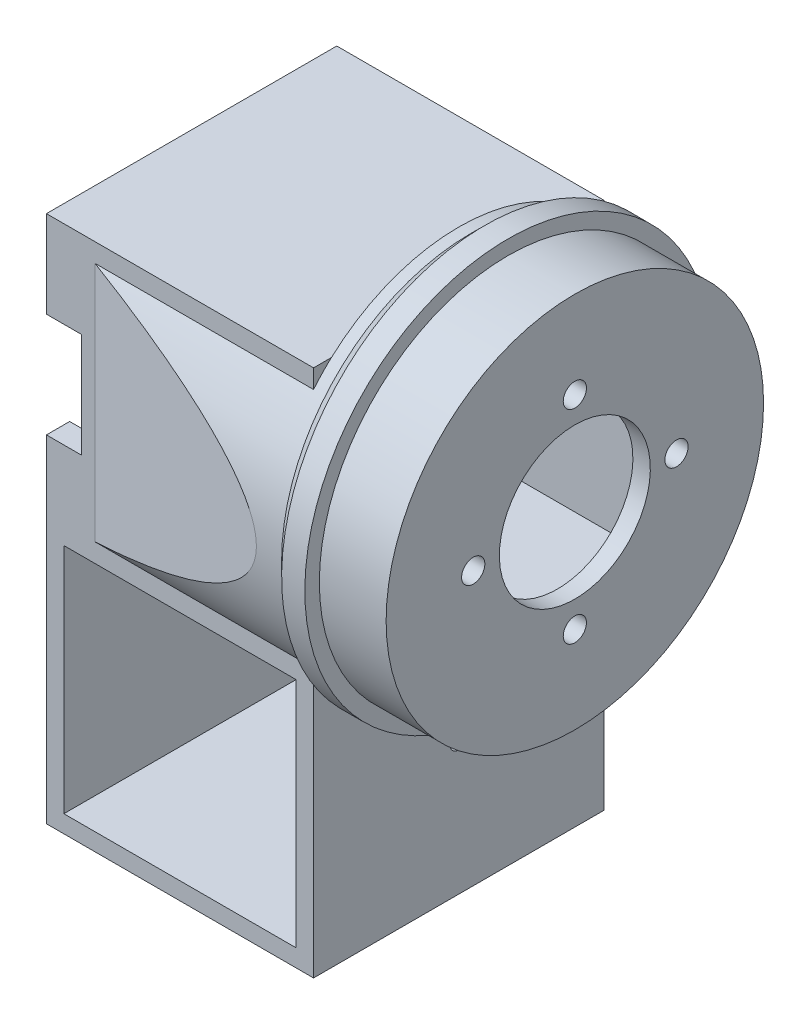
ISO-10303-21;
HEADER;
FILE_DESCRIPTION(('STEP AP214'),'2;1');
FILE_NAME('part.step','',(''),(''),'','','');
FILE_SCHEMA(('AUTOMOTIVE_DESIGN { 1 0 10303 214 1 1 1 1 }'));
ENDSEC;
DATA;
#1=APPLICATION_CONTEXT('core data for automotive mechanical design processes');
#2=APPLICATION_PROTOCOL_DEFINITION('international standard','automotive_design',2000,#1);
#3=PRODUCT_CONTEXT('',#1,'mechanical');
#4=PRODUCT('Part','Part','',(#3));
#5=PRODUCT_RELATED_PRODUCT_CATEGORY('part','',(#4));
#6=PRODUCT_DEFINITION_FORMATION('','',#4);
#7=PRODUCT_DEFINITION_CONTEXT('part definition',#1,'design');
#8=PRODUCT_DEFINITION('design','',#6,#7);
#9=PRODUCT_DEFINITION_SHAPE('','',#8);
#10=(LENGTH_UNIT() NAMED_UNIT(*) SI_UNIT(.MILLI.,.METRE.));
#11=(NAMED_UNIT(*) PLANE_ANGLE_UNIT() SI_UNIT($,.RADIAN.));
#12=(NAMED_UNIT(*) SI_UNIT($,.STERADIAN.) SOLID_ANGLE_UNIT());
#13=UNCERTAINTY_MEASURE_WITH_UNIT(LENGTH_MEASURE(1.E-05),#10,'distance_accuracy_value','');
#14=(GEOMETRIC_REPRESENTATION_CONTEXT(3) GLOBAL_UNCERTAINTY_ASSIGNED_CONTEXT((#13)) GLOBAL_UNIT_ASSIGNED_CONTEXT((#10,
#11,#12)) REPRESENTATION_CONTEXT('',''));
#15=CARTESIAN_POINT('',(0.,0.,0.));
#16=DIRECTION('',(0.,0.,1.));
#17=DIRECTION('',(1.,0.,0.));
#18=AXIS2_PLACEMENT_3D('',#15,#16,#17);
#19=CARTESIAN_POINT('',(17.,67.,25.));
#20=DIRECTION('',(-1.,0.,0.));
#21=DIRECTION('',(0.,-1.,0.));
#22=AXIS2_PLACEMENT_3D('',#19,#20,#21);
#23=CYLINDRICAL_SURFACE('',#22,32.5);
#24=CARTESIAN_POINT('',(20.,67.,25.));
#25=DIRECTION('',(1.,0.,0.));
#26=DIRECTION('',(0.,1.,0.));
#27=AXIS2_PLACEMENT_3D('',#24,#25,#26);
#28=CIRCLE('',#27,32.5);
#29=CARTESIAN_POINT('',(20.,99.5,25.));
#30=VERTEX_POINT('',#29);
#31=EDGE_CURVE('E190',#30,#30,#28,.T.);
#32=ORIENTED_EDGE('',*,*,#31,.F.);
#33=EDGE_LOOP('',(#32));
#34=FACE_BOUND('',#33,.T.);
#35=CARTESIAN_POINT('',(8.5,67.,25.));
#36=DIRECTION('',(-1.,0.,0.));
#37=DIRECTION('',(0.,-1.,0.));
#38=AXIS2_PLACEMENT_3D('',#35,#36,#37);
#39=CIRCLE('',#38,32.5);
#40=CARTESIAN_POINT('',(8.5,34.5,25.));
#41=VERTEX_POINT('',#40);
#42=EDGE_CURVE('E101',#41,#41,#39,.T.);
#43=ORIENTED_EDGE('',*,*,#42,.F.);
#44=EDGE_LOOP('',(#43));
#45=FACE_BOUND('',#44,.T.);
#46=ADVANCED_FACE('F44',(#34,#45),#23,.T.);
#47=CARTESIAN_POINT('',(0.,46.,50.));
#48=DIRECTION('',(-1.,0.,0.));
#49=DIRECTION('',(0.,-1.,0.));
#50=AXIS2_PLACEMENT_3D('',#47,#48,#49);
#51=PLANE('',#50);
#52=CARTESIAN_POINT('',(0.,67.,25.));
#53=DIRECTION('',(1.,0.,0.));
#54=DIRECTION('',(0.,1.,0.));
#55=AXIS2_PLACEMENT_3D('',#52,#53,#54);
#56=CIRCLE('',#55,32.5);
#57=CARTESIAN_POINT('',(0.,91.,46.9146070008111));
#58=VERTEX_POINT('',#57);
#59=CARTESIAN_POINT('',(0.,87.7665596572952,50.));
#60=VERTEX_POINT('',#59);
#61=EDGE_CURVE('E106',#58,#60,#56,.T.);
#62=ORIENTED_EDGE('',*,*,#61,.F.);
#63=DIRECTION('',(0.,0.,1.));
#64=VECTOR('',#63,1.);
#65=CARTESIAN_POINT('',(0.,91.,50.));
#66=LINE('',#65,#64);
#67=CARTESIAN_POINT('',(0.,91.,50.));
#68=VERTEX_POINT('',#67);
#69=EDGE_CURVE('E263',#58,#68,#66,.T.);
#70=ORIENTED_EDGE('',*,*,#69,.T.);
#71=DIRECTION('',(0.,1.,0.));
#72=VECTOR('',#71,1.);
#73=CARTESIAN_POINT('',(0.,46.,50.));
#74=LINE('',#73,#72);
#75=EDGE_CURVE('E350',#60,#68,#74,.T.);
#76=ORIENTED_EDGE('',*,*,#75,.F.);
#77=EDGE_LOOP('',(#62,#70,#76));
#78=FACE_BOUND('',#77,.T.);
#79=ADVANCED_FACE('F421',(#78),#51,.F.);
#80=CARTESIAN_POINT('',(0.,23.,25.));
#81=DIRECTION('',(-1.,0.,0.));
#82=DIRECTION('',(0.,-1.,0.));
#83=AXIS2_PLACEMENT_3D('',#80,#81,#82);
#84=CIRCLE('',#83,1.5);
#85=CARTESIAN_POINT('',(0.,21.5,25.));
#86=VERTEX_POINT('',#85);
#87=EDGE_CURVE('E135',#86,#86,#84,.T.);
#88=ORIENTED_EDGE('',*,*,#87,.T.);
#89=EDGE_LOOP('',(#88));
#90=FACE_BOUND('',#89,.T.);
#91=CARTESIAN_POINT('',(0.,46.2334403427048,50.));
#92=VERTEX_POINT('',#91);
#93=CARTESIAN_POINT('',(0.,46.2334403427048,0.));
#94=VERTEX_POINT('',#93);
#95=EDGE_CURVE('E395',#92,#94,#56,.T.);
#96=ORIENTED_EDGE('',*,*,#95,.F.);
#97=CARTESIAN_POINT('',(0.,0.,50.));
#98=VERTEX_POINT('',#97);
#99=EDGE_CURVE('E351',#98,#92,#74,.T.);
#100=ORIENTED_EDGE('',*,*,#99,.F.);
#101=DIRECTION('',(0.,0.,-1.));
#102=VECTOR('',#101,1.);
#103=CARTESIAN_POINT('',(0.,0.,50.));
#104=LINE('',#103,#102);
#105=CARTESIAN_POINT('',(0.,0.,0.));
#106=VERTEX_POINT('',#105);
#107=EDGE_CURVE('E370',#98,#106,#104,.T.);
#108=ORIENTED_EDGE('',*,*,#107,.T.);
#109=DIRECTION('',(0.,1.,0.));
#110=VECTOR('',#109,1.);
#111=CARTESIAN_POINT('',(0.,46.,0.));
#112=LINE('',#111,#110);
#113=EDGE_CURVE('E363',#106,#94,#112,.T.);
#114=ORIENTED_EDGE('',*,*,#113,.T.);
#115=EDGE_LOOP('',(#96,#100,#108,#114));
#116=FACE_BOUND('',#115,.T.);
#117=ADVANCED_FACE('F429',(#90,#116),#51,.F.);
#118=CARTESIAN_POINT('',(-46.,46.,50.));
#119=DIRECTION('',(0.,-1.,0.));
#120=DIRECTION('',(0.,0.,-1.));
#121=AXIS2_PLACEMENT_3D('',#118,#119,#120);
#122=PLANE('',#121);
#123=DIRECTION('',(1.,0.,0.));
#124=VECTOR('',#123,1.);
#125=CARTESIAN_POINT('',(-46.,46.,46.));
#126=LINE('',#125,#124);
#127=CARTESIAN_POINT('',(-46.,46.,46.));
#128=VERTEX_POINT('',#127);
#129=CARTESIAN_POINT('',(17.,46.,46.));
#130=VERTEX_POINT('',#129);
#131=EDGE_CURVE('E258',#128,#130,#126,.T.);
#132=ORIENTED_EDGE('',*,*,#131,.T.);
#133=DIRECTION('',(0.,0.,-1.));
#134=VECTOR('',#133,1.);
#135=CARTESIAN_POINT('',(17.,46.,46.));
#136=LINE('',#135,#134);
#137=CARTESIAN_POINT('',(17.,46.,4.));
#138=VERTEX_POINT('',#137);
#139=EDGE_CURVE('E197',#130,#138,#136,.T.);
#140=ORIENTED_EDGE('',*,*,#139,.T.);
#141=DIRECTION('',(1.,0.,0.));
#142=VECTOR('',#141,1.);
#143=CARTESIAN_POINT('',(-46.,46.,4.));
#144=LINE('',#143,#142);
#145=CARTESIAN_POINT('',(-46.,46.,3.99999999999999));
#146=VERTEX_POINT('',#145);
#147=EDGE_CURVE('E268',#146,#138,#144,.T.);
#148=ORIENTED_EDGE('',*,*,#147,.F.);
#149=DIRECTION('',(0.,0.,-1.));
#150=VECTOR('',#149,1.);
#151=CARTESIAN_POINT('',(-46.,46.,50.));
#152=LINE('',#151,#150);
#153=EDGE_CURVE('E354',#128,#146,#152,.T.);
#154=ORIENTED_EDGE('',*,*,#153,.F.);
#155=EDGE_LOOP('',(#132,#140,#148,#154));
#156=FACE_BOUND('',#155,.T.);
#157=ADVANCED_FACE('F525',(#156),#122,.F.);
#158=CARTESIAN_POINT('',(0.,0.,50.));
#159=DIRECTION('',(0.,0.,1.));
#160=DIRECTION('',(1.,0.,0.));
#161=AXIS2_PLACEMENT_3D('',#158,#159,#160);
#162=PLANE('',#161);
#163=DIRECTION('',(0.,1.,0.));
#164=VECTOR('',#163,1.);
#165=CARTESIAN_POINT('',(-37.6370408758295,0.,50.));
#166=LINE('',#165,#164);
#167=CARTESIAN_POINT('',(-37.6370408758295,46.2334403427048,50.));
#168=VERTEX_POINT('',#167);
#169=CARTESIAN_POINT('',(-37.6370408758295,87.7665596572952,50.));
#170=VERTEX_POINT('',#169);
#171=EDGE_CURVE('E99',#168,#170,#166,.T.);
#172=ORIENTED_EDGE('',*,*,#171,.T.);
#173=DIRECTION('',(-1.,0.,0.));
#174=VECTOR('',#173,1.);
#175=CARTESIAN_POINT('',(-37.6370408758295,87.7665596572952,50.));
#176=LINE('',#175,#174);
#177=EDGE_CURVE('E88',#170,#60,#176,.F.);
#178=ORIENTED_EDGE('',*,*,#177,.T.);
#179=ORIENTED_EDGE('',*,*,#75,.T.);
#180=DIRECTION('',(1.,0.,0.));
#181=VECTOR('',#180,1.);
#182=CARTESIAN_POINT('',(-46.,91.,50.));
#183=LINE('',#182,#181);
#184=CARTESIAN_POINT('',(-46.,91.,50.));
#185=VERTEX_POINT('',#184);
#186=EDGE_CURVE('E285',#185,#68,#183,.T.);
#187=ORIENTED_EDGE('',*,*,#186,.F.);
#188=DIRECTION('',(0.,-1.,0.));
#189=VECTOR('',#188,1.);
#190=CARTESIAN_POINT('',(-46.,46.,50.));
#191=LINE('',#190,#189);
#192=CARTESIAN_POINT('',(-46.,76.,50.));
#193=VERTEX_POINT('',#192);
#194=EDGE_CURVE('E341',#185,#193,#191,.T.);
#195=ORIENTED_EDGE('',*,*,#194,.T.);
#196=DIRECTION('',(-1.,0.,0.));
#197=VECTOR('',#196,1.);
#198=CARTESIAN_POINT('',(-46.,76.,50.));
#199=LINE('',#198,#197);
#200=CARTESIAN_POINT('',(-40.,76.,50.));
#201=VERTEX_POINT('',#200);
#202=EDGE_CURVE('E225',#201,#193,#199,.T.);
#203=ORIENTED_EDGE('',*,*,#202,.F.);
#204=DIRECTION('',(0.,1.,0.));
#205=VECTOR('',#204,1.);
#206=CARTESIAN_POINT('',(-40.,76.,50.));
#207=LINE('',#206,#205);
#208=CARTESIAN_POINT('',(-40.,58.,50.));
#209=VERTEX_POINT('',#208);
#210=EDGE_CURVE('E221',#209,#201,#207,.T.);
#211=ORIENTED_EDGE('',*,*,#210,.F.);
#212=DIRECTION('',(1.,0.,0.));
#213=VECTOR('',#212,1.);
#214=CARTESIAN_POINT('',(-46.,58.,50.));
#215=LINE('',#214,#213);
#216=CARTESIAN_POINT('',(-46.,58.,50.));
#217=VERTEX_POINT('',#216);
#218=EDGE_CURVE('E216',#217,#209,#215,.T.);
#219=ORIENTED_EDGE('',*,*,#218,.F.);
#220=CARTESIAN_POINT('',(-46.,0.,50.));
#221=VERTEX_POINT('',#220);
#222=EDGE_CURVE('E346',#217,#221,#191,.T.);
#223=ORIENTED_EDGE('',*,*,#222,.T.);
#224=DIRECTION('',(1.,0.,0.));
#225=VECTOR('',#224,1.);
#226=CARTESIAN_POINT('',(-46.,0.,50.));
#227=LINE('',#226,#225);
#228=EDGE_CURVE('E345',#221,#98,#227,.T.);
#229=ORIENTED_EDGE('',*,*,#228,.T.);
#230=ORIENTED_EDGE('',*,*,#99,.T.);
#231=DIRECTION('',(-1.,0.,0.));
#232=VECTOR('',#231,1.);
#233=CARTESIAN_POINT('',(0.,46.2334403427048,50.));
#234=LINE('',#233,#232);
#235=EDGE_CURVE('E65',#92,#168,#234,.T.);
#236=ORIENTED_EDGE('',*,*,#235,.T.);
#237=EDGE_LOOP('',(#172,#178,#179,#187,#195,#203,#211,#219,#223,#229,#230,#236));
#238=FACE_BOUND('',#237,.T.);
#239=DIRECTION('',(0.,-1.,0.));
#240=VECTOR('',#239,1.);
#241=CARTESIAN_POINT('',(-43.,43.,50.));
#242=LINE('',#241,#240);
#243=CARTESIAN_POINT('',(-43.,43.,50.));
#244=VERTEX_POINT('',#243);
#245=CARTESIAN_POINT('',(-43.,3.,50.));
#246=VERTEX_POINT('',#245);
#247=EDGE_CURVE('E293',#244,#246,#242,.T.);
#248=ORIENTED_EDGE('',*,*,#247,.F.);
#249=DIRECTION('',(-1.,0.,0.));
#250=VECTOR('',#249,1.);
#251=CARTESIAN_POINT('',(-43.,43.,50.));
#252=LINE('',#251,#250);
#253=CARTESIAN_POINT('',(-3.00000000000001,43.,50.));
#254=VERTEX_POINT('',#253);
#255=EDGE_CURVE('E306',#254,#244,#252,.T.);
#256=ORIENTED_EDGE('',*,*,#255,.F.);
#257=DIRECTION('',(0.,1.,0.));
#258=VECTOR('',#257,1.);
#259=CARTESIAN_POINT('',(-3.00000000000001,43.,50.));
#260=LINE('',#259,#258);
#261=CARTESIAN_POINT('',(-3.,3.,50.));
#262=VERTEX_POINT('',#261);
#263=EDGE_CURVE('E302',#262,#254,#260,.T.);
#264=ORIENTED_EDGE('',*,*,#263,.F.);
#265=DIRECTION('',(1.,0.,0.));
#266=VECTOR('',#265,1.);
#267=CARTESIAN_POINT('',(-43.,3.,50.));
#268=LINE('',#267,#266);
#269=EDGE_CURVE('E297',#246,#262,#268,.T.);
#270=ORIENTED_EDGE('',*,*,#269,.F.);
#271=EDGE_LOOP('',(#248,#256,#264,#270));
#272=FACE_BOUND('',#271,.T.);
#273=ADVANCED_FACE('F109',(#238,#272),#162,.T.);
#274=CARTESIAN_POINT('',(0.,0.,0.));
#275=DIRECTION('',(0.,0.,1.));
#276=DIRECTION('',(1.,0.,0.));
#277=AXIS2_PLACEMENT_3D('',#274,#275,#276);
#278=PLANE('',#277);
#279=DIRECTION('',(-1.,0.,0.));
#280=VECTOR('',#279,1.);
#281=CARTESIAN_POINT('',(-43.,43.,0.));
#282=LINE('',#281,#280);
#283=CARTESIAN_POINT('',(-3.00000000000001,43.,0.));
#284=VERTEX_POINT('',#283);
#285=CARTESIAN_POINT('',(-43.,43.,0.));
#286=VERTEX_POINT('',#285);
#287=EDGE_CURVE('E298',#284,#286,#282,.T.);
#288=ORIENTED_EDGE('',*,*,#287,.T.);
#289=DIRECTION('',(0.,-1.,0.));
#290=VECTOR('',#289,1.);
#291=CARTESIAN_POINT('',(-43.,43.,0.));
#292=LINE('',#291,#290);
#293=CARTESIAN_POINT('',(-43.,3.,0.));
#294=VERTEX_POINT('',#293);
#295=EDGE_CURVE('E289',#286,#294,#292,.T.);
#296=ORIENTED_EDGE('',*,*,#295,.T.);
#297=DIRECTION('',(1.,0.,0.));
#298=VECTOR('',#297,1.);
#299=CARTESIAN_POINT('',(-43.,3.,0.));
#300=LINE('',#299,#298);
#301=CARTESIAN_POINT('',(-3.,3.,0.));
#302=VERTEX_POINT('',#301);
#303=EDGE_CURVE('E314',#294,#302,#300,.T.);
#304=ORIENTED_EDGE('',*,*,#303,.T.);
#305=DIRECTION('',(0.,1.,0.));
#306=VECTOR('',#305,1.);
#307=CARTESIAN_POINT('',(-3.00000000000001,43.,0.));
#308=LINE('',#307,#306);
#309=EDGE_CURVE('E318',#302,#284,#308,.T.);
#310=ORIENTED_EDGE('',*,*,#309,.T.);
#311=EDGE_LOOP('',(#288,#296,#304,#310));
#312=FACE_BOUND('',#311,.T.);
#313=CARTESIAN_POINT('',(0.,87.7665596572952,0.));
#314=VERTEX_POINT('',#313);
#315=CARTESIAN_POINT('',(0.,91.,0.));
#316=VERTEX_POINT('',#315);
#317=EDGE_CURVE('E362',#314,#316,#112,.T.);
#318=ORIENTED_EDGE('',*,*,#317,.F.);
#319=DIRECTION('',(-1.,0.,0.));
#320=VECTOR('',#319,1.);
#321=CARTESIAN_POINT('',(0.,87.7665596572952,0.));
#322=LINE('',#321,#320);
#323=CARTESIAN_POINT('',(-37.6370408758295,87.7665596572952,0.));
#324=VERTEX_POINT('',#323);
#325=EDGE_CURVE('E114',#314,#324,#322,.T.);
#326=ORIENTED_EDGE('',*,*,#325,.T.);
#327=DIRECTION('',(0.,-1.,0.));
#328=VECTOR('',#327,1.);
#329=CARTESIAN_POINT('',(-37.6370408758295,46.2334403427048,0.));
#330=LINE('',#329,#328);
#331=CARTESIAN_POINT('',(-37.6370408758295,46.2334403427048,0.));
#332=VERTEX_POINT('',#331);
#333=EDGE_CURVE('E394',#324,#332,#330,.T.);
#334=ORIENTED_EDGE('',*,*,#333,.T.);
#335=DIRECTION('',(-1.,0.,0.));
#336=VECTOR('',#335,1.);
#337=CARTESIAN_POINT('',(-37.6370408758295,46.2334403427048,0.));
#338=LINE('',#337,#336);
#339=EDGE_CURVE('E390',#332,#94,#338,.F.);
#340=ORIENTED_EDGE('',*,*,#339,.T.);
#341=ORIENTED_EDGE('',*,*,#113,.F.);
#342=DIRECTION('',(1.,0.,0.));
#343=VECTOR('',#342,1.);
#344=CARTESIAN_POINT('',(-46.,0.,0.));
#345=LINE('',#344,#343);
#346=CARTESIAN_POINT('',(-46.,0.,0.));
#347=VERTEX_POINT('',#346);
#348=EDGE_CURVE('E358',#347,#106,#345,.T.);
#349=ORIENTED_EDGE('',*,*,#348,.F.);
#350=DIRECTION('',(0.,-1.,0.));
#351=VECTOR('',#350,1.);
#352=CARTESIAN_POINT('',(-46.,46.,0.));
#353=LINE('',#352,#351);
#354=CARTESIAN_POINT('',(-46.,91.,0.));
#355=VERTEX_POINT('',#354);
#356=EDGE_CURVE('E340',#355,#347,#353,.T.);
#357=ORIENTED_EDGE('',*,*,#356,.F.);
#358=DIRECTION('',(1.,0.,0.));
#359=VECTOR('',#358,1.);
#360=CARTESIAN_POINT('',(-46.,91.,0.));
#361=LINE('',#360,#359);
#362=EDGE_CURVE('E279',#355,#316,#361,.T.);
#363=ORIENTED_EDGE('',*,*,#362,.T.);
#364=EDGE_LOOP('',(#318,#326,#334,#340,#341,#349,#357,#363));
#365=FACE_BOUND('',#364,.T.);
#366=ADVANCED_FACE('F402',(#312,#365),#278,.F.);
#367=CARTESIAN_POINT('',(-46.,46.,50.));
#368=DIRECTION('',(1.,0.,0.));
#369=DIRECTION('',(0.,0.,-1.));
#370=AXIS2_PLACEMENT_3D('',#367,#368,#369);
#371=PLANE('',#370);
#372=CARTESIAN_POINT('',(-46.,23.,25.));
#373=DIRECTION('',(-1.,0.,0.));
#374=DIRECTION('',(0.,0.,1.));
#375=AXIS2_PLACEMENT_3D('',#372,#373,#374);
#376=CIRCLE('',#375,1.5);
#377=CARTESIAN_POINT('',(-46.,23.,26.5));
#378=VERTEX_POINT('',#377);
#379=EDGE_CURVE('E129',#378,#378,#376,.T.);
#380=ORIENTED_EDGE('',*,*,#379,.F.);
#381=EDGE_LOOP('',(#380));
#382=FACE_BOUND('',#381,.T.);
#383=DIRECTION('',(0.,-1.,0.));
#384=VECTOR('',#383,1.);
#385=CARTESIAN_POINT('',(-46.,88.,46.));
#386=LINE('',#385,#384);
#387=CARTESIAN_POINT('',(-46.,88.,46.));
#388=VERTEX_POINT('',#387);
#389=CARTESIAN_POINT('',(-46.,76.,46.));
#390=VERTEX_POINT('',#389);
#391=EDGE_CURVE('E246',#388,#390,#386,.T.);
#392=ORIENTED_EDGE('',*,*,#391,.T.);
#393=DIRECTION('',(0.,0.,1.));
#394=VECTOR('',#393,1.);
#395=CARTESIAN_POINT('',(-46.,76.,44.));
#396=LINE('',#395,#394);
#397=EDGE_CURVE('E230',#390,#193,#396,.T.);
#398=ORIENTED_EDGE('',*,*,#397,.T.);
#399=ORIENTED_EDGE('',*,*,#194,.F.);
#400=DIRECTION('',(0.,0.,1.));
#401=VECTOR('',#400,1.);
#402=CARTESIAN_POINT('',(-46.,91.,50.));
#403=LINE('',#402,#401);
#404=EDGE_CURVE('E275',#355,#185,#403,.T.);
#405=ORIENTED_EDGE('',*,*,#404,.F.);
#406=ORIENTED_EDGE('',*,*,#356,.T.);
#407=DIRECTION('',(0.,0.,-1.));
#408=VECTOR('',#407,1.);
#409=CARTESIAN_POINT('',(-46.,0.,50.));
#410=LINE('',#409,#408);
#411=EDGE_CURVE('E374',#221,#347,#410,.T.);
#412=ORIENTED_EDGE('',*,*,#411,.F.);
#413=ORIENTED_EDGE('',*,*,#222,.F.);
#414=DIRECTION('',(0.,0.,1.));
#415=VECTOR('',#414,1.);
#416=CARTESIAN_POINT('',(-46.,58.,44.));
#417=LINE('',#416,#415);
#418=CARTESIAN_POINT('',(-46.,58.,46.));
#419=VERTEX_POINT('',#418);
#420=EDGE_CURVE('E229',#419,#217,#417,.T.);
#421=ORIENTED_EDGE('',*,*,#420,.F.);
#422=EDGE_CURVE('E234',#419,#128,#386,.T.);
#423=ORIENTED_EDGE('',*,*,#422,.T.);
#424=ORIENTED_EDGE('',*,*,#153,.T.);
#425=DIRECTION('',(0.,1.,0.));
#426=VECTOR('',#425,1.);
#427=CARTESIAN_POINT('',(-46.,88.,4.00000000000001));
#428=LINE('',#427,#426);
#429=CARTESIAN_POINT('',(-46.,88.,4.00000000000001));
#430=VERTEX_POINT('',#429);
#431=EDGE_CURVE('E250',#146,#430,#428,.T.);
#432=ORIENTED_EDGE('',*,*,#431,.T.);
#433=DIRECTION('',(0.,0.,1.));
#434=VECTOR('',#433,1.);
#435=CARTESIAN_POINT('',(-46.,88.,46.));
#436=LINE('',#435,#434);
#437=EDGE_CURVE('E254',#430,#388,#436,.T.);
#438=ORIENTED_EDGE('',*,*,#437,.T.);
#439=EDGE_LOOP('',(#392,#398,#399,#405,#406,#412,#413,#421,#423,#424,#432,#438));
#440=FACE_BOUND('',#439,.T.);
#441=ADVANCED_FACE('F630',(#382,#440),#371,.F.);
#442=CARTESIAN_POINT('',(-46.,0.,50.));
#443=DIRECTION('',(0.,1.,0.));
#444=DIRECTION('',(0.,0.,1.));
#445=AXIS2_PLACEMENT_3D('',#442,#443,#444);
#446=PLANE('',#445);
#447=CARTESIAN_POINT('',(-23.,0.,25.));
#448=DIRECTION('',(0.,-1.,0.));
#449=DIRECTION('',(0.,0.,-1.));
#450=AXIS2_PLACEMENT_3D('',#447,#448,#449);
#451=CIRCLE('',#450,1.5);
#452=CARTESIAN_POINT('',(-23.,0.,23.5));
#453=VERTEX_POINT('',#452);
#454=EDGE_CURVE('E143',#453,#453,#451,.T.);
#455=ORIENTED_EDGE('',*,*,#454,.F.);
#456=EDGE_LOOP('',(#455));
#457=FACE_BOUND('',#456,.T.);
#458=ORIENTED_EDGE('',*,*,#348,.T.);
#459=ORIENTED_EDGE('',*,*,#107,.F.);
#460=ORIENTED_EDGE('',*,*,#228,.F.);
#461=ORIENTED_EDGE('',*,*,#411,.T.);
#462=EDGE_LOOP('',(#458,#459,#460,#461));
#463=FACE_BOUND('',#462,.T.);
#464=ADVANCED_FACE('F645',(#457,#463),#446,.F.);
#465=CARTESIAN_POINT('',(0.,91.,3.08539299918887));
#466=VERTEX_POINT('',#465);
#467=EDGE_CURVE('E217',#314,#466,#56,.T.);
#468=ORIENTED_EDGE('',*,*,#467,.F.);
#469=ORIENTED_EDGE('',*,*,#317,.T.);
#470=EDGE_CURVE('E280',#316,#466,#66,.T.);
#471=ORIENTED_EDGE('',*,*,#470,.T.);
#472=EDGE_LOOP('',(#468,#469,#471));
#473=FACE_BOUND('',#472,.T.);
#474=ADVANCED_FACE('F432',(#473),#51,.F.);
#475=CARTESIAN_POINT('',(-43.,43.,50.));
#476=DIRECTION('',(1.,0.,0.));
#477=DIRECTION('',(0.,1.,0.));
#478=AXIS2_PLACEMENT_3D('',#475,#476,#477);
#479=PLANE('',#478);
#480=CARTESIAN_POINT('',(-43.,23.,25.));
#481=DIRECTION('',(1.,0.,0.));
#482=DIRECTION('',(0.,1.,0.));
#483=AXIS2_PLACEMENT_3D('',#480,#481,#482);
#484=CIRCLE('',#483,1.5);
#485=CARTESIAN_POINT('',(-43.,24.5,25.));
#486=VERTEX_POINT('',#485);
#487=EDGE_CURVE('E128',#486,#486,#484,.T.);
#488=ORIENTED_EDGE('',*,*,#487,.F.);
#489=EDGE_LOOP('',(#488));
#490=FACE_BOUND('',#489,.T.);
#491=ORIENTED_EDGE('',*,*,#295,.F.);
#492=DIRECTION('',(0.,0.,-1.));
#493=VECTOR('',#492,1.);
#494=CARTESIAN_POINT('',(-43.,43.,50.));
#495=LINE('',#494,#493);
#496=EDGE_CURVE('E310',#244,#286,#495,.T.);
#497=ORIENTED_EDGE('',*,*,#496,.F.);
#498=ORIENTED_EDGE('',*,*,#247,.T.);
#499=DIRECTION('',(0.,0.,-1.));
#500=VECTOR('',#499,1.);
#501=CARTESIAN_POINT('',(-43.,3.,50.));
#502=LINE('',#501,#500);
#503=EDGE_CURVE('E336',#246,#294,#502,.T.);
#504=ORIENTED_EDGE('',*,*,#503,.T.);
#505=EDGE_LOOP('',(#491,#497,#498,#504));
#506=FACE_BOUND('',#505,.T.);
#507=ADVANCED_FACE('F654',(#490,#506),#479,.T.);
#508=CARTESIAN_POINT('',(-43.,3.,50.));
#509=DIRECTION('',(0.,1.,0.));
#510=DIRECTION('',(0.,0.,1.));
#511=AXIS2_PLACEMENT_3D('',#508,#509,#510);
#512=PLANE('',#511);
#513=CARTESIAN_POINT('',(-23.,3.,25.));
#514=DIRECTION('',(0.,1.,0.));
#515=DIRECTION('',(0.,0.,1.));
#516=AXIS2_PLACEMENT_3D('',#513,#514,#515);
#517=CIRCLE('',#516,1.5);
#518=CARTESIAN_POINT('',(-23.,3.,26.5));
#519=VERTEX_POINT('',#518);
#520=EDGE_CURVE('E49',#519,#519,#517,.T.);
#521=ORIENTED_EDGE('',*,*,#520,.F.);
#522=EDGE_LOOP('',(#521));
#523=FACE_BOUND('',#522,.T.);
#524=ORIENTED_EDGE('',*,*,#303,.F.);
#525=ORIENTED_EDGE('',*,*,#503,.F.);
#526=ORIENTED_EDGE('',*,*,#269,.T.);
#527=DIRECTION('',(0.,0.,-1.));
#528=VECTOR('',#527,1.);
#529=CARTESIAN_POINT('',(-3.,3.,50.));
#530=LINE('',#529,#528);
#531=EDGE_CURVE('E332',#262,#302,#530,.T.);
#532=ORIENTED_EDGE('',*,*,#531,.T.);
#533=EDGE_LOOP('',(#524,#525,#526,#532));
#534=FACE_BOUND('',#533,.T.);
#535=ADVANCED_FACE('F668',(#523,#534),#512,.T.);
#536=CARTESIAN_POINT('',(-3.00000000000001,43.,50.));
#537=DIRECTION('',(-1.,0.,0.));
#538=DIRECTION('',(0.,-1.,0.));
#539=AXIS2_PLACEMENT_3D('',#536,#537,#538);
#540=PLANE('',#539);
#541=CARTESIAN_POINT('',(-3.00000000000001,23.,25.));
#542=DIRECTION('',(-1.,0.,0.));
#543=DIRECTION('',(0.,-1.,0.));
#544=AXIS2_PLACEMENT_3D('',#541,#542,#543);
#545=CIRCLE('',#544,1.5);
#546=CARTESIAN_POINT('',(-3.00000000000001,21.5,25.));
#547=VERTEX_POINT('',#546);
#548=EDGE_CURVE('E125',#547,#547,#545,.T.);
#549=ORIENTED_EDGE('',*,*,#548,.F.);
#550=EDGE_LOOP('',(#549));
#551=FACE_BOUND('',#550,.T.);
#552=ORIENTED_EDGE('',*,*,#309,.F.);
#553=ORIENTED_EDGE('',*,*,#531,.F.);
#554=ORIENTED_EDGE('',*,*,#263,.T.);
#555=DIRECTION('',(0.,0.,-1.));
#556=VECTOR('',#555,1.);
#557=CARTESIAN_POINT('',(-3.00000000000001,43.,50.));
#558=LINE('',#557,#556);
#559=EDGE_CURVE('E328',#254,#284,#558,.T.);
#560=ORIENTED_EDGE('',*,*,#559,.T.);
#561=EDGE_LOOP('',(#552,#553,#554,#560));
#562=FACE_BOUND('',#561,.T.);
#563=ADVANCED_FACE('F671',(#551,#562),#540,.T.);
#564=CARTESIAN_POINT('',(-43.,43.,50.));
#565=DIRECTION('',(0.,-1.,0.));
#566=DIRECTION('',(0.,0.,-1.));
#567=AXIS2_PLACEMENT_3D('',#564,#565,#566);
#568=PLANE('',#567);
#569=ORIENTED_EDGE('',*,*,#287,.F.);
#570=ORIENTED_EDGE('',*,*,#559,.F.);
#571=ORIENTED_EDGE('',*,*,#255,.T.);
#572=ORIENTED_EDGE('',*,*,#496,.T.);
#573=EDGE_LOOP('',(#569,#570,#571,#572));
#574=FACE_BOUND('',#573,.T.);
#575=ADVANCED_FACE('F675',(#574),#568,.T.);
#576=CARTESIAN_POINT('',(-46.,91.,50.));
#577=DIRECTION('',(0.,1.,0.));
#578=DIRECTION('',(-1.,0.,0.));
#579=AXIS2_PLACEMENT_3D('',#576,#577,#578);
#580=PLANE('',#579);
#581=ORIENTED_EDGE('',*,*,#470,.F.);
#582=ORIENTED_EDGE('',*,*,#362,.F.);
#583=ORIENTED_EDGE('',*,*,#404,.T.);
#584=ORIENTED_EDGE('',*,*,#186,.T.);
#585=ORIENTED_EDGE('',*,*,#69,.F.);
#586=EDGE_CURVE('E284',#466,#58,#66,.T.);
#587=ORIENTED_EDGE('',*,*,#586,.F.);
#588=EDGE_LOOP('',(#581,#582,#583,#584,#585,#587));
#589=FACE_BOUND('',#588,.T.);
#590=ADVANCED_FACE('F621',(#589),#580,.T.);
#591=CARTESIAN_POINT('',(-46.,88.,46.));
#592=DIRECTION('',(0.,0.,1.));
#593=DIRECTION('',(1.,0.,0.));
#594=AXIS2_PLACEMENT_3D('',#591,#592,#593);
#595=PLANE('',#594);
#596=DIRECTION('',(0.,1.,0.));
#597=VECTOR('',#596,1.);
#598=CARTESIAN_POINT('',(-40.,88.,46.));
#599=LINE('',#598,#597);
#600=CARTESIAN_POINT('',(-40.,58.,46.));
#601=VERTEX_POINT('',#600);
#602=CARTESIAN_POINT('',(-40.,76.,46.));
#603=VERTEX_POINT('',#602);
#604=EDGE_CURVE('E382',#601,#603,#599,.T.);
#605=ORIENTED_EDGE('',*,*,#604,.T.);
#606=DIRECTION('',(-1.,0.,0.));
#607=VECTOR('',#606,1.);
#608=CARTESIAN_POINT('',(-46.,76.,46.));
#609=LINE('',#608,#607);
#610=EDGE_CURVE('E386',#603,#390,#609,.T.);
#611=ORIENTED_EDGE('',*,*,#610,.T.);
#612=ORIENTED_EDGE('',*,*,#391,.F.);
#613=DIRECTION('',(1.,0.,0.));
#614=VECTOR('',#613,1.);
#615=CARTESIAN_POINT('',(-46.,88.,46.));
#616=LINE('',#615,#614);
#617=CARTESIAN_POINT('',(17.,88.,46.));
#618=VERTEX_POINT('',#617);
#619=EDGE_CURVE('E259',#388,#618,#616,.T.);
#620=ORIENTED_EDGE('',*,*,#619,.T.);
#621=DIRECTION('',(0.,-1.,0.));
#622=VECTOR('',#621,1.);
#623=CARTESIAN_POINT('',(17.,88.,46.));
#624=LINE('',#623,#622);
#625=EDGE_CURVE('E209',#618,#130,#624,.T.);
#626=ORIENTED_EDGE('',*,*,#625,.T.);
#627=ORIENTED_EDGE('',*,*,#131,.F.);
#628=ORIENTED_EDGE('',*,*,#422,.F.);
#629=DIRECTION('',(1.,0.,0.));
#630=VECTOR('',#629,1.);
#631=CARTESIAN_POINT('',(-46.,58.,46.));
#632=LINE('',#631,#630);
#633=EDGE_CURVE('E378',#419,#601,#632,.T.);
#634=ORIENTED_EDGE('',*,*,#633,.T.);
#635=EDGE_LOOP('',(#605,#611,#612,#620,#626,#627,#628,#634));
#636=FACE_BOUND('',#635,.T.);
#637=ADVANCED_FACE('F531',(#636),#595,.F.);
#638=CARTESIAN_POINT('',(-46.,88.,46.));
#639=DIRECTION('',(0.,1.,0.));
#640=DIRECTION('',(-1.,0.,0.));
#641=AXIS2_PLACEMENT_3D('',#638,#639,#640);
#642=PLANE('',#641);
#643=DIRECTION('',(1.,0.,0.));
#644=VECTOR('',#643,1.);
#645=CARTESIAN_POINT('',(-46.,88.,4.00000000000001));
#646=LINE('',#645,#644);
#647=CARTESIAN_POINT('',(17.,88.,4.00000000000001));
#648=VERTEX_POINT('',#647);
#649=EDGE_CURVE('E264',#430,#648,#646,.T.);
#650=ORIENTED_EDGE('',*,*,#649,.T.);
#651=DIRECTION('',(0.,0.,1.));
#652=VECTOR('',#651,1.);
#653=CARTESIAN_POINT('',(17.,88.,46.));
#654=LINE('',#653,#652);
#655=EDGE_CURVE('E205',#648,#618,#654,.T.);
#656=ORIENTED_EDGE('',*,*,#655,.T.);
#657=ORIENTED_EDGE('',*,*,#619,.F.);
#658=ORIENTED_EDGE('',*,*,#437,.F.);
#659=EDGE_LOOP('',(#650,#656,#657,#658));
#660=FACE_BOUND('',#659,.T.);
#661=ADVANCED_FACE('F684',(#660),#642,.F.);
#662=CARTESIAN_POINT('',(-46.,88.,4.00000000000001));
#663=DIRECTION('',(0.,0.,-1.));
#664=DIRECTION('',(0.,1.,0.));
#665=AXIS2_PLACEMENT_3D('',#662,#663,#664);
#666=PLANE('',#665);
#667=ORIENTED_EDGE('',*,*,#147,.T.);
#668=DIRECTION('',(0.,1.,0.));
#669=VECTOR('',#668,1.);
#670=CARTESIAN_POINT('',(17.,88.,4.00000000000001));
#671=LINE('',#670,#669);
#672=EDGE_CURVE('E201',#138,#648,#671,.T.);
#673=ORIENTED_EDGE('',*,*,#672,.T.);
#674=ORIENTED_EDGE('',*,*,#649,.F.);
#675=ORIENTED_EDGE('',*,*,#431,.F.);
#676=EDGE_LOOP('',(#667,#673,#674,#675));
#677=FACE_BOUND('',#676,.T.);
#678=ADVANCED_FACE('F521',(#677),#666,.F.);
#679=CARTESIAN_POINT('',(-46.,76.,44.));
#680=DIRECTION('',(0.,1.,0.));
#681=DIRECTION('',(-1.,0.,0.));
#682=AXIS2_PLACEMENT_3D('',#679,#680,#681);
#683=PLANE('',#682);
#684=DIRECTION('',(0.,0.,1.));
#685=VECTOR('',#684,1.);
#686=CARTESIAN_POINT('',(-40.,76.,44.));
#687=LINE('',#686,#685);
#688=EDGE_CURVE('E235',#603,#201,#687,.T.);
#689=ORIENTED_EDGE('',*,*,#688,.T.);
#690=ORIENTED_EDGE('',*,*,#202,.T.);
#691=ORIENTED_EDGE('',*,*,#397,.F.);
#692=ORIENTED_EDGE('',*,*,#610,.F.);
#693=EDGE_LOOP('',(#689,#690,#691,#692));
#694=FACE_BOUND('',#693,.T.);
#695=ADVANCED_FACE('F633',(#694),#683,.F.);
#696=CARTESIAN_POINT('',(-40.,76.,44.));
#697=DIRECTION('',(1.,0.,0.));
#698=DIRECTION('',(0.,1.,0.));
#699=AXIS2_PLACEMENT_3D('',#696,#697,#698);
#700=PLANE('',#699);
#701=DIRECTION('',(0.,0.,1.));
#702=VECTOR('',#701,1.);
#703=CARTESIAN_POINT('',(-40.,58.,44.));
#704=LINE('',#703,#702);
#705=EDGE_CURVE('E239',#601,#209,#704,.T.);
#706=ORIENTED_EDGE('',*,*,#705,.T.);
#707=ORIENTED_EDGE('',*,*,#210,.T.);
#708=ORIENTED_EDGE('',*,*,#688,.F.);
#709=ORIENTED_EDGE('',*,*,#604,.F.);
#710=EDGE_LOOP('',(#706,#707,#708,#709));
#711=FACE_BOUND('',#710,.T.);
#712=ADVANCED_FACE('F637',(#711),#700,.F.);
#713=CARTESIAN_POINT('',(-46.,58.,44.));
#714=DIRECTION('',(0.,-1.,0.));
#715=DIRECTION('',(0.,0.,-1.));
#716=AXIS2_PLACEMENT_3D('',#713,#714,#715);
#717=PLANE('',#716);
#718=ORIENTED_EDGE('',*,*,#420,.T.);
#719=ORIENTED_EDGE('',*,*,#218,.T.);
#720=ORIENTED_EDGE('',*,*,#705,.F.);
#721=ORIENTED_EDGE('',*,*,#633,.F.);
#722=EDGE_LOOP('',(#718,#719,#720,#721));
#723=FACE_BOUND('',#722,.T.);
#724=ADVANCED_FACE('F449',(#723),#717,.F.);
#725=CARTESIAN_POINT('',(0.,67.,25.));
#726=DIRECTION('',(1.,0.,0.));
#727=DIRECTION('',(0.,1.,0.));
#728=AXIS2_PLACEMENT_3D('',#725,#726,#727);
#729=PLANE('',#728);
#730=EDGE_CURVE('E213',#466,#58,#56,.T.);
#731=ORIENTED_EDGE('',*,*,#730,.F.);
#732=ORIENTED_EDGE('',*,*,#586,.T.);
#733=EDGE_LOOP('',(#731,#732));
#734=FACE_BOUND('',#733,.T.);
#735=ADVANCED_FACE('F439',(#734),#729,.F.);
#736=CARTESIAN_POINT('',(1.99999999999998,67.,25.));
#737=DIRECTION('',(-1.,0.,0.));
#738=DIRECTION('',(0.,0.,1.));
#739=AXIS2_PLACEMENT_3D('',#736,#737,#738);
#740=CIRCLE('',#739,32.5);
#741=CARTESIAN_POINT('',(1.99999999999998,67.,57.5));
#742=VERTEX_POINT('',#741);
#743=EDGE_CURVE('E56',#742,#742,#740,.T.);
#744=ORIENTED_EDGE('',*,*,#743,.T.);
#745=EDGE_LOOP('',(#744));
#746=FACE_BOUND('',#745,.T.);
#747=ORIENTED_EDGE('',*,*,#61,.T.);
#748=ORIENTED_EDGE('',*,*,#177,.F.);
#749=CARTESIAN_POINT('',(-155.252793612793,67.,25.));
#750=DIRECTION('',(0.207911690817756,0.,-0.978147600733806));
#751=DIRECTION('',(-0.978147600733806,0.,-0.207911690817756));
#752=AXIS2_PLACEMENT_3D('',#749,#750,#751);
#753=ELLIPSE('',#752,156.316366204187,32.5);
#754=EDGE_CURVE('E95',#170,#168,#753,.T.);
#755=ORIENTED_EDGE('',*,*,#754,.T.);
#756=ORIENTED_EDGE('',*,*,#235,.F.);
#757=ORIENTED_EDGE('',*,*,#95,.T.);
#758=ORIENTED_EDGE('',*,*,#339,.F.);
#759=CARTESIAN_POINT('',(-155.252793612793,67.,25.));
#760=DIRECTION('',(-0.207911690817756,0.,-0.978147600733806));
#761=DIRECTION('',(-0.978147600733806,0.,0.207911690817756));
#762=AXIS2_PLACEMENT_3D('',#759,#760,#761);
#763=ELLIPSE('',#762,156.316366204187,32.5);
#764=EDGE_CURVE('E77',#332,#324,#763,.F.);
#765=ORIENTED_EDGE('',*,*,#764,.T.);
#766=ORIENTED_EDGE('',*,*,#325,.F.);
#767=ORIENTED_EDGE('',*,*,#467,.T.);
#768=ORIENTED_EDGE('',*,*,#730,.T.);
#769=EDGE_LOOP('',(#747,#748,#755,#756,#757,#758,#765,#766,#767,#768));
#770=FACE_BOUND('',#769,.T.);
#771=ADVANCED_FACE('F104',(#746,#770),#23,.T.);
#772=CARTESIAN_POINT('',(20.,67.,25.));
#773=DIRECTION('',(1.,0.,0.));
#774=DIRECTION('',(0.,1.,0.));
#775=AXIS2_PLACEMENT_3D('',#772,#773,#774);
#776=PLANE('',#775);
#777=CARTESIAN_POINT('',(20.,67.,42.5));
#778=DIRECTION('',(1.,0.,0.));
#779=DIRECTION('',(0.,1.,0.));
#780=AXIS2_PLACEMENT_3D('',#777,#778,#779);
#781=CIRCLE('',#780,2.);
#782=CARTESIAN_POINT('',(20.,69.,42.5));
#783=VERTEX_POINT('',#782);
#784=EDGE_CURVE('E162',#783,#783,#781,.T.);
#785=ORIENTED_EDGE('',*,*,#784,.F.);
#786=EDGE_LOOP('',(#785));
#787=FACE_BOUND('',#786,.T.);
#788=CARTESIAN_POINT('',(20.,67.,7.50000000000001));
#789=DIRECTION('',(1.,0.,0.));
#790=DIRECTION('',(0.,1.,0.));
#791=AXIS2_PLACEMENT_3D('',#788,#789,#790);
#792=CIRCLE('',#791,2.);
#793=CARTESIAN_POINT('',(20.,69.,7.50000000000001));
#794=VERTEX_POINT('',#793);
#795=EDGE_CURVE('E178',#794,#794,#792,.T.);
#796=ORIENTED_EDGE('',*,*,#795,.F.);
#797=EDGE_LOOP('',(#796));
#798=FACE_BOUND('',#797,.T.);
#799=ORIENTED_EDGE('',*,*,#31,.T.);
#800=EDGE_LOOP('',(#799));
#801=FACE_BOUND('',#800,.T.);
#802=CARTESIAN_POINT('',(20.,84.5,25.));
#803=DIRECTION('',(1.,0.,0.));
#804=DIRECTION('',(0.,1.,0.));
#805=AXIS2_PLACEMENT_3D('',#802,#803,#804);
#806=CIRCLE('',#805,2.);
#807=CARTESIAN_POINT('',(20.,86.5,25.));
#808=VERTEX_POINT('',#807);
#809=EDGE_CURVE('E186',#808,#808,#806,.T.);
#810=ORIENTED_EDGE('',*,*,#809,.F.);
#811=EDGE_LOOP('',(#810));
#812=FACE_BOUND('',#811,.T.);
#813=CARTESIAN_POINT('',(20.,49.5,25.));
#814=DIRECTION('',(1.,0.,0.));
#815=DIRECTION('',(0.,1.,0.));
#816=AXIS2_PLACEMENT_3D('',#813,#814,#815);
#817=CIRCLE('',#816,2.);
#818=CARTESIAN_POINT('',(20.,51.5,25.));
#819=VERTEX_POINT('',#818);
#820=EDGE_CURVE('E170',#819,#819,#817,.T.);
#821=ORIENTED_EDGE('',*,*,#820,.F.);
#822=EDGE_LOOP('',(#821));
#823=FACE_BOUND('',#822,.T.);
#824=CARTESIAN_POINT('',(20.,67.,25.));
#825=DIRECTION('',(1.,0.,0.));
#826=DIRECTION('',(0.,1.,0.));
#827=AXIS2_PLACEMENT_3D('',#824,#825,#826);
#828=CIRCLE('',#827,13.);
#829=CARTESIAN_POINT('',(20.,80.,25.));
#830=VERTEX_POINT('',#829);
#831=EDGE_CURVE('E154',#830,#830,#828,.T.);
#832=ORIENTED_EDGE('',*,*,#831,.F.);
#833=EDGE_LOOP('',(#832));
#834=FACE_BOUND('',#833,.T.);
#835=ADVANCED_FACE('F438',(#787,#798,#801,#812,#823,#834),#776,.T.);
#836=CARTESIAN_POINT('',(17.,67.,25.));
#837=DIRECTION('',(1.,0.,0.));
#838=DIRECTION('',(0.,1.,0.));
#839=AXIS2_PLACEMENT_3D('',#836,#837,#838);
#840=PLANE('',#839);
#841=ORIENTED_EDGE('',*,*,#672,.F.);
#842=ORIENTED_EDGE('',*,*,#139,.F.);
#843=ORIENTED_EDGE('',*,*,#625,.F.);
#844=ORIENTED_EDGE('',*,*,#655,.F.);
#845=EDGE_LOOP('',(#841,#842,#843,#844));
#846=FACE_BOUND('',#845,.T.);
#847=CARTESIAN_POINT('',(17.,84.5,25.));
#848=DIRECTION('',(1.,0.,0.));
#849=DIRECTION('',(0.,1.,0.));
#850=AXIS2_PLACEMENT_3D('',#847,#848,#849);
#851=CIRCLE('',#850,2.);
#852=CARTESIAN_POINT('',(17.,86.5,25.));
#853=VERTEX_POINT('',#852);
#854=EDGE_CURVE('E182',#853,#853,#851,.T.);
#855=ORIENTED_EDGE('',*,*,#854,.T.);
#856=EDGE_LOOP('',(#855));
#857=FACE_BOUND('',#856,.T.);
#858=CARTESIAN_POINT('',(17.,67.,7.50000000000001));
#859=DIRECTION('',(1.,0.,0.));
#860=DIRECTION('',(0.,1.,0.));
#861=AXIS2_PLACEMENT_3D('',#858,#859,#860);
#862=CIRCLE('',#861,2.);
#863=CARTESIAN_POINT('',(17.,69.,7.50000000000001));
#864=VERTEX_POINT('',#863);
#865=EDGE_CURVE('E174',#864,#864,#862,.T.);
#866=ORIENTED_EDGE('',*,*,#865,.T.);
#867=EDGE_LOOP('',(#866));
#868=FACE_BOUND('',#867,.T.);
#869=CARTESIAN_POINT('',(17.,49.5,25.));
#870=DIRECTION('',(1.,0.,0.));
#871=DIRECTION('',(0.,1.,0.));
#872=AXIS2_PLACEMENT_3D('',#869,#870,#871);
#873=CIRCLE('',#872,2.);
#874=CARTESIAN_POINT('',(17.,51.5,25.));
#875=VERTEX_POINT('',#874);
#876=EDGE_CURVE('E166',#875,#875,#873,.T.);
#877=ORIENTED_EDGE('',*,*,#876,.T.);
#878=EDGE_LOOP('',(#877));
#879=FACE_BOUND('',#878,.T.);
#880=CARTESIAN_POINT('',(17.,67.,42.5));
#881=DIRECTION('',(1.,0.,0.));
#882=DIRECTION('',(0.,1.,0.));
#883=AXIS2_PLACEMENT_3D('',#880,#881,#882);
#884=CIRCLE('',#883,2.);
#885=CARTESIAN_POINT('',(17.,69.,42.5));
#886=VERTEX_POINT('',#885);
#887=EDGE_CURVE('E158',#886,#886,#884,.T.);
#888=ORIENTED_EDGE('',*,*,#887,.T.);
#889=EDGE_LOOP('',(#888));
#890=FACE_BOUND('',#889,.T.);
#891=CARTESIAN_POINT('',(17.,67.,25.));
#892=DIRECTION('',(1.,0.,0.));
#893=DIRECTION('',(0.,1.,0.));
#894=AXIS2_PLACEMENT_3D('',#891,#892,#893);
#895=CIRCLE('',#894,13.);
#896=CARTESIAN_POINT('',(17.,80.,25.));
#897=VERTEX_POINT('',#896);
#898=EDGE_CURVE('E153',#897,#897,#895,.T.);
#899=ORIENTED_EDGE('',*,*,#898,.T.);
#900=EDGE_LOOP('',(#899));
#901=FACE_BOUND('',#900,.T.);
#902=ADVANCED_FACE('F445',(#846,#857,#868,#879,#890,#901),#840,.F.);
#903=CARTESIAN_POINT('',(20.,84.5,25.));
#904=DIRECTION('',(-1.,0.,0.));
#905=DIRECTION('',(0.,-1.,0.));
#906=AXIS2_PLACEMENT_3D('',#903,#904,#905);
#907=CYLINDRICAL_SURFACE('',#906,2.);
#908=ORIENTED_EDGE('',*,*,#809,.T.);
#909=EDGE_LOOP('',(#908));
#910=FACE_BOUND('',#909,.T.);
#911=ORIENTED_EDGE('',*,*,#854,.F.);
#912=EDGE_LOOP('',(#911));
#913=FACE_BOUND('',#912,.T.);
#914=ADVANCED_FACE('F484',(#910,#913),#907,.F.);
#915=CARTESIAN_POINT('',(20.,67.,7.50000000000001));
#916=DIRECTION('',(-1.,0.,0.));
#917=DIRECTION('',(0.,-1.,0.));
#918=AXIS2_PLACEMENT_3D('',#915,#916,#917);
#919=CYLINDRICAL_SURFACE('',#918,2.);
#920=ORIENTED_EDGE('',*,*,#795,.T.);
#921=EDGE_LOOP('',(#920));
#922=FACE_BOUND('',#921,.T.);
#923=ORIENTED_EDGE('',*,*,#865,.F.);
#924=EDGE_LOOP('',(#923));
#925=FACE_BOUND('',#924,.T.);
#926=ADVANCED_FACE('F480',(#922,#925),#919,.F.);
#927=CARTESIAN_POINT('',(20.,49.5,25.));
#928=DIRECTION('',(-1.,0.,0.));
#929=DIRECTION('',(0.,-1.,0.));
#930=AXIS2_PLACEMENT_3D('',#927,#928,#929);
#931=CYLINDRICAL_SURFACE('',#930,2.);
#932=ORIENTED_EDGE('',*,*,#820,.T.);
#933=EDGE_LOOP('',(#932));
#934=FACE_BOUND('',#933,.T.);
#935=ORIENTED_EDGE('',*,*,#876,.F.);
#936=EDGE_LOOP('',(#935));
#937=FACE_BOUND('',#936,.T.);
#938=ADVANCED_FACE('F476',(#934,#937),#931,.F.);
#939=CARTESIAN_POINT('',(20.,67.,42.5));
#940=DIRECTION('',(-1.,0.,0.));
#941=DIRECTION('',(0.,-1.,0.));
#942=AXIS2_PLACEMENT_3D('',#939,#940,#941);
#943=CYLINDRICAL_SURFACE('',#942,2.);
#944=ORIENTED_EDGE('',*,*,#784,.T.);
#945=EDGE_LOOP('',(#944));
#946=FACE_BOUND('',#945,.T.);
#947=ORIENTED_EDGE('',*,*,#887,.F.);
#948=EDGE_LOOP('',(#947));
#949=FACE_BOUND('',#948,.T.);
#950=ADVANCED_FACE('F415',(#946,#949),#943,.F.);
#951=CARTESIAN_POINT('',(20.,67.,25.));
#952=DIRECTION('',(-1.,0.,0.));
#953=DIRECTION('',(0.,-1.,0.));
#954=AXIS2_PLACEMENT_3D('',#951,#952,#953);
#955=CYLINDRICAL_SURFACE('',#954,13.);
#956=ORIENTED_EDGE('',*,*,#831,.T.);
#957=EDGE_LOOP('',(#956));
#958=FACE_BOUND('',#957,.T.);
#959=ORIENTED_EDGE('',*,*,#898,.F.);
#960=EDGE_LOOP('',(#959));
#961=FACE_BOUND('',#960,.T.);
#962=ADVANCED_FACE('F408',(#958,#961),#955,.F.);
#963=CARTESIAN_POINT('',(0.,67.,-8.00000000000026));
#964=DIRECTION('',(-0.207911690817756,0.,-0.978147600733806));
#965=DIRECTION('',(0.,-1.,0.));
#966=AXIS2_PLACEMENT_3D('',#963,#964,#965);
#967=PLANE('',#966);
#968=ORIENTED_EDGE('',*,*,#764,.F.);
#969=ORIENTED_EDGE('',*,*,#333,.F.);
#970=EDGE_LOOP('',(#968,#969));
#971=FACE_BOUND('',#970,.T.);
#972=ADVANCED_FACE('F406',(#971),#967,.T.);
#973=CARTESIAN_POINT('',(-37.6370408758295,0.,50.));
#974=DIRECTION('',(0.207911690817756,0.,-0.978147600733806));
#975=DIRECTION('',(0.,1.,0.));
#976=AXIS2_PLACEMENT_3D('',#973,#974,#975);
#977=PLANE('',#976);
#978=ORIENTED_EDGE('',*,*,#171,.F.);
#979=ORIENTED_EDGE('',*,*,#754,.F.);
#980=EDGE_LOOP('',(#978,#979));
#981=FACE_BOUND('',#980,.T.);
#982=ADVANCED_FACE('F98',(#981),#977,.F.);
#983=CARTESIAN_POINT('',(8.5,67.,25.));
#984=DIRECTION('',(-1.,0.,0.));
#985=DIRECTION('',(0.,-1.,0.));
#986=AXIS2_PLACEMENT_3D('',#983,#984,#985);
#987=CYLINDRICAL_SURFACE('',#986,35.);
#988=CARTESIAN_POINT('',(4.49999999999995,67.,25.));
#989=DIRECTION('',(1.,0.,0.));
#990=DIRECTION('',(0.,0.,-1.));
#991=AXIS2_PLACEMENT_3D('',#988,#989,#990);
#992=CIRCLE('',#991,35.);
#993=CARTESIAN_POINT('',(4.49999999999995,67.,-9.99999999999999));
#994=VERTEX_POINT('',#993);
#995=EDGE_CURVE('E11',#994,#994,#992,.T.);
#996=ORIENTED_EDGE('',*,*,#995,.T.);
#997=EDGE_LOOP('',(#996));
#998=FACE_BOUND('',#997,.T.);
#999=CARTESIAN_POINT('',(8.5,67.,25.));
#1000=DIRECTION('',(-1.,0.,0.));
#1001=DIRECTION('',(0.,-1.,0.));
#1002=AXIS2_PLACEMENT_3D('',#999,#1000,#1001);
#1003=CIRCLE('',#1002,35.);
#1004=CARTESIAN_POINT('',(8.5,32.,25.));
#1005=VERTEX_POINT('',#1004);
#1006=EDGE_CURVE('E149',#1005,#1005,#1003,.T.);
#1007=ORIENTED_EDGE('',*,*,#1006,.T.);
#1008=EDGE_LOOP('',(#1007));
#1009=FACE_BOUND('',#1008,.T.);
#1010=ADVANCED_FACE('F414',(#998,#1009),#987,.T.);
#1011=CARTESIAN_POINT('',(8.5,67.,25.));
#1012=DIRECTION('',(-1.,0.,0.));
#1013=DIRECTION('',(0.,-1.,0.));
#1014=AXIS2_PLACEMENT_3D('',#1011,#1012,#1013);
#1015=PLANE('',#1014);
#1016=ORIENTED_EDGE('',*,*,#42,.T.);
#1017=EDGE_LOOP('',(#1016));
#1018=FACE_BOUND('',#1017,.T.);
#1019=ORIENTED_EDGE('',*,*,#1006,.F.);
#1020=EDGE_LOOP('',(#1019));
#1021=FACE_BOUND('',#1020,.T.);
#1022=ADVANCED_FACE('F455',(#1018,#1021),#1015,.F.);
#1023=CARTESIAN_POINT('',(1.99999999999998,67.,25.));
#1024=DIRECTION('',(1.,0.,0.));
#1025=DIRECTION('',(0.,0.,-1.));
#1026=AXIS2_PLACEMENT_3D('',#1023,#1024,#1025);
#1027=CONICAL_SURFACE('',#1026,32.5,0.785398163397454);
#1028=ORIENTED_EDGE('',*,*,#995,.F.);
#1029=EDGE_LOOP('',(#1028));
#1030=FACE_BOUND('',#1029,.T.);
#1031=ORIENTED_EDGE('',*,*,#743,.F.);
#1032=EDGE_LOOP('',(#1031));
#1033=FACE_BOUND('',#1032,.T.);
#1034=ADVANCED_FACE('F47',(#1030,#1033),#1027,.T.);
#1035=CARTESIAN_POINT('',(20.,23.,25.));
#1036=DIRECTION('',(-1.,0.,0.));
#1037=DIRECTION('',(0.,0.,1.));
#1038=AXIS2_PLACEMENT_3D('',#1035,#1036,#1037);
#1039=CYLINDRICAL_SURFACE('',#1038,1.5);
#1040=ORIENTED_EDGE('',*,*,#548,.T.);
#1041=EDGE_LOOP('',(#1040));
#1042=FACE_BOUND('',#1041,.T.);
#1043=ORIENTED_EDGE('',*,*,#87,.F.);
#1044=EDGE_LOOP('',(#1043));
#1045=FACE_BOUND('',#1044,.T.);
#1046=ADVANCED_FACE('F454',(#1042,#1045),#1039,.F.);
#1047=ORIENTED_EDGE('',*,*,#487,.T.);
#1048=EDGE_LOOP('',(#1047));
#1049=FACE_BOUND('',#1048,.T.);
#1050=ORIENTED_EDGE('',*,*,#379,.T.);
#1051=EDGE_LOOP('',(#1050));
#1052=FACE_BOUND('',#1051,.T.);
#1053=ADVANCED_FACE('F461',(#1049,#1052),#1039,.F.);
#1054=CARTESIAN_POINT('',(-23.,13.5,25.));
#1055=DIRECTION('',(0.,-1.,0.));
#1056=DIRECTION('',(0.,0.,-1.));
#1057=AXIS2_PLACEMENT_3D('',#1054,#1055,#1056);
#1058=CYLINDRICAL_SURFACE('',#1057,1.5);
#1059=ORIENTED_EDGE('',*,*,#520,.T.);
#1060=EDGE_LOOP('',(#1059));
#1061=FACE_BOUND('',#1060,.T.);
#1062=ORIENTED_EDGE('',*,*,#454,.T.);
#1063=EDGE_LOOP('',(#1062));
#1064=FACE_BOUND('',#1063,.T.);
#1065=ADVANCED_FACE('F839',(#1061,#1064),#1058,.F.);
#1066=CLOSED_SHELL('',(#46,#79,#117,#157,#273,#366,#441,#464,#474,#507,#535,#563,#575,#590,#637,
#661,#678,#695,#712,#724,#735,#771,#835,#902,#914,#926,#938,#950,#962,#972,#982,#1010,#1022,
#1034,#1046,#1053,#1065));
#1067=MANIFOLD_SOLID_BREP('B2',#1066);
#1068=ADVANCED_BREP_SHAPE_REPRESENTATION('',(#18,#1067),#14);
#1069=SHAPE_DEFINITION_REPRESENTATION(#9,#1068);
ENDSEC;
END-ISO-10303-21;
